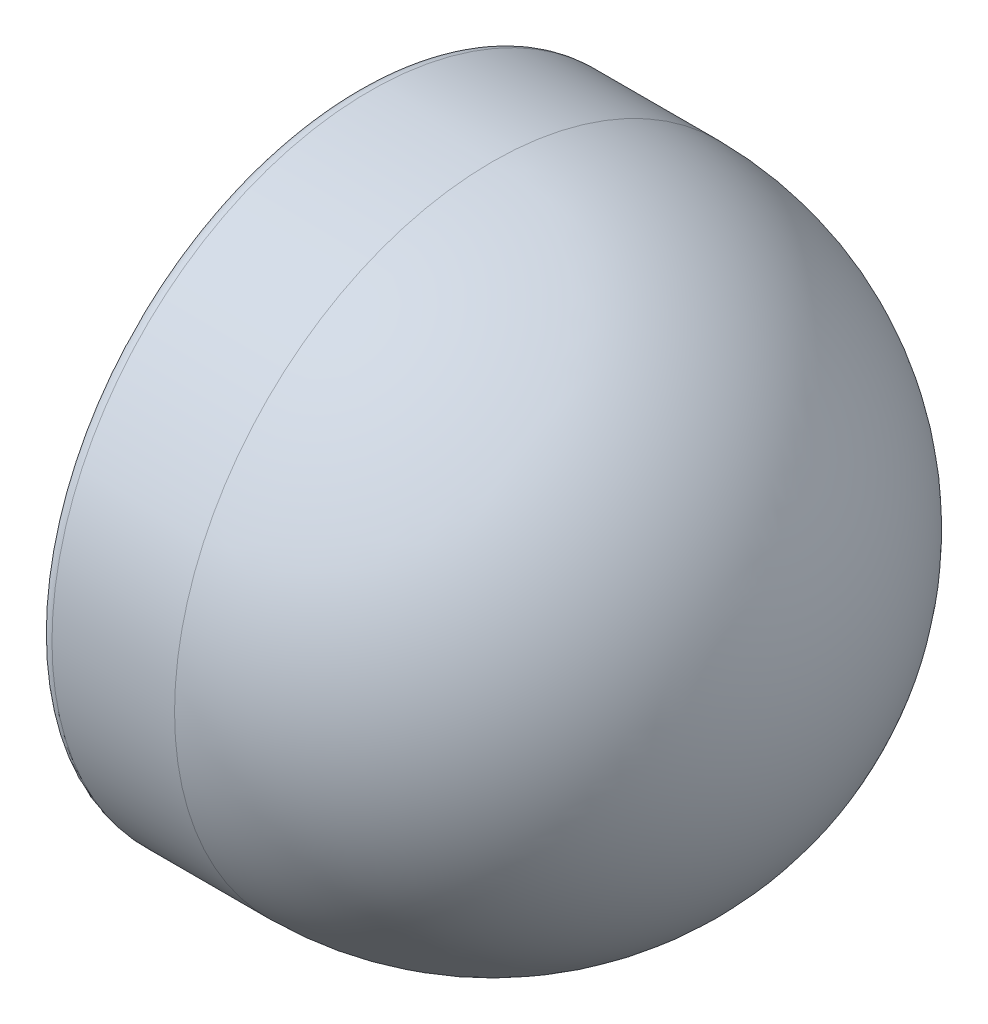
ISO-10303-21;
HEADER;
FILE_DESCRIPTION(('STEP AP214'),'2;1');
FILE_NAME('part.step','',(''),(''),'','','');
FILE_SCHEMA(('AUTOMOTIVE_DESIGN { 1 0 10303 214 1 1 1 1 }'));
ENDSEC;
DATA;
#1=APPLICATION_CONTEXT('core data for automotive mechanical design processes');
#2=APPLICATION_PROTOCOL_DEFINITION('international standard','automotive_design',2000,#1);
#3=PRODUCT_CONTEXT('',#1,'mechanical');
#4=PRODUCT('Part','Part','',(#3));
#5=PRODUCT_RELATED_PRODUCT_CATEGORY('part','',(#4));
#6=PRODUCT_DEFINITION_FORMATION('','',#4);
#7=PRODUCT_DEFINITION_CONTEXT('part definition',#1,'design');
#8=PRODUCT_DEFINITION('design','',#6,#7);
#9=PRODUCT_DEFINITION_SHAPE('','',#8);
#10=(LENGTH_UNIT() NAMED_UNIT(*) SI_UNIT(.MILLI.,.METRE.));
#11=(NAMED_UNIT(*) PLANE_ANGLE_UNIT() SI_UNIT($,.RADIAN.));
#12=(NAMED_UNIT(*) SI_UNIT($,.STERADIAN.) SOLID_ANGLE_UNIT());
#13=UNCERTAINTY_MEASURE_WITH_UNIT(LENGTH_MEASURE(1.E-05),#10,'distance_accuracy_value','');
#14=(GEOMETRIC_REPRESENTATION_CONTEXT(3) GLOBAL_UNCERTAINTY_ASSIGNED_CONTEXT((#13)) GLOBAL_UNIT_ASSIGNED_CONTEXT((#10,
#11,#12)) REPRESENTATION_CONTEXT('',''));
#15=CARTESIAN_POINT('',(0.,0.,0.));
#16=DIRECTION('',(0.,0.,1.));
#17=DIRECTION('',(1.,0.,0.));
#18=AXIS2_PLACEMENT_3D('',#15,#16,#17);
#19=CARTESIAN_POINT('',(-70.,0.,0.));
#20=DIRECTION('',(-1.,0.,0.));
#21=DIRECTION('',(0.,1.,0.));
#22=AXIS2_PLACEMENT_3D('',#19,#20,#21);
#23=SPHERICAL_SURFACE('',#22,70.);
#24=CARTESIAN_POINT('',(-70.,0.,0.));
#25=DIRECTION('',(-1.,0.,0.));
#26=DIRECTION('',(0.,0.,1.));
#27=AXIS2_PLACEMENT_3D('',#24,#25,#26);
#28=CIRCLE('',#27,70.);
#29=CARTESIAN_POINT('',(-70.,0.,70.));
#30=VERTEX_POINT('',#29);
#31=EDGE_CURVE('E10',#30,#30,#28,.T.);
#32=ORIENTED_EDGE('',*,*,#31,.F.);
#33=EDGE_LOOP('',(#32));
#34=FACE_BOUND('',#33,.T.);
#35=ADVANCED_FACE('F37',(#34),#23,.T.);
#36=CARTESIAN_POINT('',(-70.,0.,0.));
#37=DIRECTION('',(-1.,0.,0.));
#38=DIRECTION('',(0.,0.,1.));
#39=AXIS2_PLACEMENT_3D('',#36,#37,#38);
#40=CYLINDRICAL_SURFACE('',#39,70.);
#41=CARTESIAN_POINT('',(-97.,0.,0.));
#42=DIRECTION('',(-1.,0.,0.));
#43=DIRECTION('',(0.,0.,1.));
#44=AXIS2_PLACEMENT_3D('',#41,#42,#43);
#45=CIRCLE('',#44,70.);
#46=CARTESIAN_POINT('',(-97.,0.,70.));
#47=VERTEX_POINT('',#46);
#48=EDGE_CURVE('E43',#47,#47,#45,.T.);
#49=ORIENTED_EDGE('',*,*,#48,.F.);
#50=EDGE_LOOP('',(#49));
#51=FACE_BOUND('',#50,.T.);
#52=ORIENTED_EDGE('',*,*,#31,.T.);
#53=EDGE_LOOP('',(#52));
#54=FACE_BOUND('',#53,.T.);
#55=ADVANCED_FACE('F184',(#51,#54),#40,.T.);
#56=CARTESIAN_POINT('',(-97.,0.,0.));
#57=DIRECTION('',(-1.,0.,0.));
#58=DIRECTION('',(0.,0.,1.));
#59=AXIS2_PLACEMENT_3D('',#56,#57,#58);
#60=TOROIDAL_SURFACE('',#59,67.,3.);
#61=CARTESIAN_POINT('',(-100.,0.,0.));
#62=DIRECTION('',(-1.,0.,0.));
#63=DIRECTION('',(0.,0.,1.));
#64=AXIS2_PLACEMENT_3D('',#61,#62,#63);
#65=CIRCLE('',#64,67.);
#66=CARTESIAN_POINT('',(-100.,0.,67.));
#67=VERTEX_POINT('',#66);
#68=EDGE_CURVE('E47',#67,#67,#65,.T.);
#69=ORIENTED_EDGE('',*,*,#68,.F.);
#70=EDGE_LOOP('',(#69));
#71=FACE_BOUND('',#70,.T.);
#72=ORIENTED_EDGE('',*,*,#48,.T.);
#73=EDGE_LOOP('',(#72));
#74=FACE_BOUND('',#73,.T.);
#75=ADVANCED_FACE('F179',(#71,#74),#60,.T.);
#76=CARTESIAN_POINT('',(-100.,67.,0.));
#77=DIRECTION('',(1.,0.,0.));
#78=DIRECTION('',(0.,0.,-1.));
#79=AXIS2_PLACEMENT_3D('',#76,#77,#78);
#80=PLANE('',#79);
#81=CARTESIAN_POINT('',(-100.,0.,0.));
#82=DIRECTION('',(-1.,0.,0.));
#83=DIRECTION('',(0.,0.,1.));
#84=AXIS2_PLACEMENT_3D('',#81,#82,#83);
#85=CIRCLE('',#84,61.5);
#86=CARTESIAN_POINT('',(-100.,0.,61.5));
#87=VERTEX_POINT('',#86);
#88=EDGE_CURVE('E51',#87,#87,#85,.T.);
#89=ORIENTED_EDGE('',*,*,#88,.F.);
#90=EDGE_LOOP('',(#89));
#91=FACE_BOUND('',#90,.T.);
#92=ORIENTED_EDGE('',*,*,#68,.T.);
#93=EDGE_LOOP('',(#92));
#94=FACE_BOUND('',#93,.T.);
#95=ADVANCED_FACE('F173',(#91,#94),#80,.F.);
#96=CARTESIAN_POINT('',(-98.5,0.,0.));
#97=DIRECTION('',(-1.,0.,0.));
#98=DIRECTION('',(0.,0.,1.));
#99=AXIS2_PLACEMENT_3D('',#96,#97,#98);
#100=TOROIDAL_SURFACE('',#99,61.5,1.5);
#101=CARTESIAN_POINT('',(-98.5,0.,0.));
#102=DIRECTION('',(-1.,0.,0.));
#103=DIRECTION('',(0.,0.,1.));
#104=AXIS2_PLACEMENT_3D('',#101,#102,#103);
#105=CIRCLE('',#104,60.);
#106=CARTESIAN_POINT('',(-98.5,0.,60.));
#107=VERTEX_POINT('',#106);
#108=EDGE_CURVE('E56',#107,#107,#105,.T.);
#109=ORIENTED_EDGE('',*,*,#108,.F.);
#110=EDGE_LOOP('',(#109));
#111=FACE_BOUND('',#110,.T.);
#112=ORIENTED_EDGE('',*,*,#88,.T.);
#113=EDGE_LOOP('',(#112));
#114=FACE_BOUND('',#113,.T.);
#115=ADVANCED_FACE('F167',(#111,#114),#100,.T.);
#116=CARTESIAN_POINT('',(-70.,0.,0.));
#117=DIRECTION('',(-1.,0.,0.));
#118=DIRECTION('',(0.,0.,1.));
#119=AXIS2_PLACEMENT_3D('',#116,#117,#118);
#120=CYLINDRICAL_SURFACE('',#119,60.);
#121=CARTESIAN_POINT('',(-96.6213203435597,0.,0.));
#122=DIRECTION('',(-1.,0.,0.));
#123=DIRECTION('',(0.,0.,1.));
#124=AXIS2_PLACEMENT_3D('',#121,#122,#123);
#125=CIRCLE('',#124,60.);
#126=CARTESIAN_POINT('',(-96.6213203435597,0.,60.));
#127=VERTEX_POINT('',#126);
#128=EDGE_CURVE('E59',#127,#127,#125,.T.);
#129=ORIENTED_EDGE('',*,*,#128,.F.);
#130=EDGE_LOOP('',(#129));
#131=FACE_BOUND('',#130,.T.);
#132=ORIENTED_EDGE('',*,*,#108,.T.);
#133=EDGE_LOOP('',(#132));
#134=FACE_BOUND('',#133,.T.);
#135=ADVANCED_FACE('F161',(#131,#134),#120,.F.);
#136=CARTESIAN_POINT('',(-96.6213203435597,0.,0.));
#137=DIRECTION('',(-1.,0.,0.));
#138=DIRECTION('',(0.,0.,1.));
#139=AXIS2_PLACEMENT_3D('',#136,#137,#138);
#140=TOROIDAL_SURFACE('',#139,61.5,1.50000000000001);
#141=CARTESIAN_POINT('',(-95.5606601717798,0.,0.));
#142=DIRECTION('',(-1.,0.,0.));
#143=DIRECTION('',(0.,0.,1.));
#144=AXIS2_PLACEMENT_3D('',#141,#142,#143);
#145=CIRCLE('',#144,60.4393398282202);
#146=CARTESIAN_POINT('',(-95.5606601717798,0.,60.4393398282202));
#147=VERTEX_POINT('',#146);
#148=EDGE_CURVE('E62',#147,#147,#145,.T.);
#149=ORIENTED_EDGE('',*,*,#148,.F.);
#150=EDGE_LOOP('',(#149));
#151=FACE_BOUND('',#150,.T.);
#152=ORIENTED_EDGE('',*,*,#128,.T.);
#153=EDGE_LOOP('',(#152));
#154=FACE_BOUND('',#153,.T.);
#155=ADVANCED_FACE('F155',(#151,#154),#140,.T.);
#156=CARTESIAN_POINT('',(-95.5606601717798,0.,0.));
#157=DIRECTION('',(1.,0.,0.));
#158=DIRECTION('',(0.,0.,-1.));
#159=AXIS2_PLACEMENT_3D('',#156,#157,#158);
#160=CONICAL_SURFACE('',#159,60.4393398282202,0.785398163397454);
#161=CARTESIAN_POINT('',(-92.,0.,0.));
#162=DIRECTION('',(-1.,0.,0.));
#163=DIRECTION('',(0.,0.,1.));
#164=AXIS2_PLACEMENT_3D('',#161,#162,#163);
#165=CIRCLE('',#164,64.);
#166=CARTESIAN_POINT('',(-92.,0.,64.));
#167=VERTEX_POINT('',#166);
#168=EDGE_CURVE('E65',#167,#167,#165,.T.);
#169=ORIENTED_EDGE('',*,*,#168,.F.);
#170=EDGE_LOOP('',(#169));
#171=FACE_BOUND('',#170,.T.);
#172=ORIENTED_EDGE('',*,*,#148,.T.);
#173=EDGE_LOOP('',(#172));
#174=FACE_BOUND('',#173,.T.);
#175=ADVANCED_FACE('F149',(#171,#174),#160,.F.);
#176=CARTESIAN_POINT('',(-92.,64.,0.));
#177=DIRECTION('',(-1.,0.,0.));
#178=DIRECTION('',(0.,0.,1.));
#179=AXIS2_PLACEMENT_3D('',#176,#177,#178);
#180=PLANE('',#179);
#181=CARTESIAN_POINT('',(-92.,0.,0.));
#182=DIRECTION('',(-1.,0.,0.));
#183=DIRECTION('',(0.,0.,1.));
#184=AXIS2_PLACEMENT_3D('',#181,#182,#183);
#185=CIRCLE('',#184,64.7071067811866);
#186=CARTESIAN_POINT('',(-92.,0.,64.7071067811866));
#187=VERTEX_POINT('',#186);
#188=EDGE_CURVE('E68',#187,#187,#185,.T.);
#189=ORIENTED_EDGE('',*,*,#188,.F.);
#190=EDGE_LOOP('',(#189));
#191=FACE_BOUND('',#190,.T.);
#192=ORIENTED_EDGE('',*,*,#168,.T.);
#193=EDGE_LOOP('',(#192));
#194=FACE_BOUND('',#193,.T.);
#195=ADVANCED_FACE('F143',(#191,#194),#180,.F.);
#196=CARTESIAN_POINT('',(-70.,0.,0.));
#197=DIRECTION('',(-1.,0.,0.));
#198=DIRECTION('',(0.,0.,1.));
#199=AXIS2_PLACEMENT_3D('',#196,#197,#198);
#200=CYLINDRICAL_SURFACE('',#199,64.7071067811866);
#201=CARTESIAN_POINT('',(-92.7071067811866,0.,0.));
#202=DIRECTION('',(-1.,0.,0.));
#203=DIRECTION('',(0.,0.,1.));
#204=AXIS2_PLACEMENT_3D('',#201,#202,#203);
#205=CIRCLE('',#204,64.7071067811866);
#206=CARTESIAN_POINT('',(-92.7071067811866,0.,64.7071067811866));
#207=VERTEX_POINT('',#206);
#208=EDGE_CURVE('E71',#207,#207,#205,.T.);
#209=ORIENTED_EDGE('',*,*,#208,.F.);
#210=EDGE_LOOP('',(#209));
#211=FACE_BOUND('',#210,.T.);
#212=ORIENTED_EDGE('',*,*,#188,.T.);
#213=EDGE_LOOP('',(#212));
#214=FACE_BOUND('',#213,.T.);
#215=ADVANCED_FACE('F137',(#211,#214),#200,.T.);
#216=CARTESIAN_POINT('',(-92.7071067811866,0.,0.));
#217=DIRECTION('',(1.,0.,0.));
#218=DIRECTION('',(0.,0.,-1.));
#219=AXIS2_PLACEMENT_3D('',#216,#217,#218);
#220=CONICAL_SURFACE('',#219,64.7071067811866,0.785398163397451);
#221=CARTESIAN_POINT('',(-96.2677669529664,0.,0.));
#222=DIRECTION('',(-1.,0.,0.));
#223=DIRECTION('',(0.,0.,1.));
#224=AXIS2_PLACEMENT_3D('',#221,#222,#223);
#225=CIRCLE('',#224,61.1464466094067);
#226=CARTESIAN_POINT('',(-96.2677669529664,0.,61.1464466094067));
#227=VERTEX_POINT('',#226);
#228=EDGE_CURVE('E74',#227,#227,#225,.T.);
#229=ORIENTED_EDGE('',*,*,#228,.F.);
#230=EDGE_LOOP('',(#229));
#231=FACE_BOUND('',#230,.T.);
#232=ORIENTED_EDGE('',*,*,#208,.T.);
#233=EDGE_LOOP('',(#232));
#234=FACE_BOUND('',#233,.T.);
#235=ADVANCED_FACE('F131',(#231,#234),#220,.T.);
#236=CARTESIAN_POINT('',(-96.6213203435597,0.,0.));
#237=DIRECTION('',(-1.,0.,0.));
#238=DIRECTION('',(0.,0.,1.));
#239=AXIS2_PLACEMENT_3D('',#236,#237,#238);
#240=TOROIDAL_SURFACE('',#239,61.5,0.499999999999999);
#241=CARTESIAN_POINT('',(-96.6213203435597,0.,0.));
#242=DIRECTION('',(-1.,0.,0.));
#243=DIRECTION('',(0.,0.,1.));
#244=AXIS2_PLACEMENT_3D('',#241,#242,#243);
#245=CIRCLE('',#244,61.);
#246=CARTESIAN_POINT('',(-96.6213203435597,0.,61.));
#247=VERTEX_POINT('',#246);
#248=EDGE_CURVE('E77',#247,#247,#245,.T.);
#249=ORIENTED_EDGE('',*,*,#248,.F.);
#250=EDGE_LOOP('',(#249));
#251=FACE_BOUND('',#250,.T.);
#252=ORIENTED_EDGE('',*,*,#228,.T.);
#253=EDGE_LOOP('',(#252));
#254=FACE_BOUND('',#253,.T.);
#255=ADVANCED_FACE('F125',(#251,#254),#240,.F.);
#256=CARTESIAN_POINT('',(-70.,0.,0.));
#257=DIRECTION('',(-1.,0.,0.));
#258=DIRECTION('',(0.,0.,1.));
#259=AXIS2_PLACEMENT_3D('',#256,#257,#258);
#260=CYLINDRICAL_SURFACE('',#259,61.);
#261=CARTESIAN_POINT('',(-98.5,0.,0.));
#262=DIRECTION('',(-1.,0.,0.));
#263=DIRECTION('',(0.,0.,1.));
#264=AXIS2_PLACEMENT_3D('',#261,#262,#263);
#265=CIRCLE('',#264,61.);
#266=CARTESIAN_POINT('',(-98.5,0.,61.));
#267=VERTEX_POINT('',#266);
#268=EDGE_CURVE('E80',#267,#267,#265,.T.);
#269=ORIENTED_EDGE('',*,*,#268,.F.);
#270=EDGE_LOOP('',(#269));
#271=FACE_BOUND('',#270,.T.);
#272=ORIENTED_EDGE('',*,*,#248,.T.);
#273=EDGE_LOOP('',(#272));
#274=FACE_BOUND('',#273,.T.);
#275=ADVANCED_FACE('F119',(#271,#274),#260,.T.);
#276=CARTESIAN_POINT('',(-98.5,0.,0.));
#277=DIRECTION('',(-1.,0.,0.));
#278=DIRECTION('',(0.,0.,1.));
#279=AXIS2_PLACEMENT_3D('',#276,#277,#278);
#280=TOROIDAL_SURFACE('',#279,61.5,0.499999999999994);
#281=CARTESIAN_POINT('',(-99.,0.,0.));
#282=DIRECTION('',(-1.,0.,0.));
#283=DIRECTION('',(0.,0.,1.));
#284=AXIS2_PLACEMENT_3D('',#281,#282,#283);
#285=CIRCLE('',#284,61.5);
#286=CARTESIAN_POINT('',(-99.,0.,61.5));
#287=VERTEX_POINT('',#286);
#288=EDGE_CURVE('E83',#287,#287,#285,.T.);
#289=ORIENTED_EDGE('',*,*,#288,.F.);
#290=EDGE_LOOP('',(#289));
#291=FACE_BOUND('',#290,.T.);
#292=ORIENTED_EDGE('',*,*,#268,.T.);
#293=EDGE_LOOP('',(#292));
#294=FACE_BOUND('',#293,.T.);
#295=ADVANCED_FACE('F113',(#291,#294),#280,.F.);
#296=CARTESIAN_POINT('',(-99.,67.,0.));
#297=DIRECTION('',(-1.,0.,0.));
#298=DIRECTION('',(0.,0.,1.));
#299=AXIS2_PLACEMENT_3D('',#296,#297,#298);
#300=PLANE('',#299);
#301=CARTESIAN_POINT('',(-99.,0.,0.));
#302=DIRECTION('',(-1.,0.,0.));
#303=DIRECTION('',(0.,0.,1.));
#304=AXIS2_PLACEMENT_3D('',#301,#302,#303);
#305=CIRCLE('',#304,67.);
#306=CARTESIAN_POINT('',(-99.,0.,67.));
#307=VERTEX_POINT('',#306);
#308=EDGE_CURVE('E86',#307,#307,#305,.T.);
#309=ORIENTED_EDGE('',*,*,#308,.F.);
#310=EDGE_LOOP('',(#309));
#311=FACE_BOUND('',#310,.T.);
#312=ORIENTED_EDGE('',*,*,#288,.T.);
#313=EDGE_LOOP('',(#312));
#314=FACE_BOUND('',#313,.T.);
#315=ADVANCED_FACE('F107',(#311,#314),#300,.F.);
#316=CARTESIAN_POINT('',(-97.,0.,0.));
#317=DIRECTION('',(-1.,0.,0.));
#318=DIRECTION('',(0.,0.,1.));
#319=AXIS2_PLACEMENT_3D('',#316,#317,#318);
#320=TOROIDAL_SURFACE('',#319,67.,2.);
#321=CARTESIAN_POINT('',(-97.,0.,0.));
#322=DIRECTION('',(-1.,0.,0.));
#323=DIRECTION('',(0.,0.,1.));
#324=AXIS2_PLACEMENT_3D('',#321,#322,#323);
#325=CIRCLE('',#324,69.);
#326=CARTESIAN_POINT('',(-97.,0.,69.));
#327=VERTEX_POINT('',#326);
#328=EDGE_CURVE('E89',#327,#327,#325,.T.);
#329=ORIENTED_EDGE('',*,*,#328,.F.);
#330=EDGE_LOOP('',(#329));
#331=FACE_BOUND('',#330,.T.);
#332=ORIENTED_EDGE('',*,*,#308,.T.);
#333=EDGE_LOOP('',(#332));
#334=FACE_BOUND('',#333,.T.);
#335=ADVANCED_FACE('F101',(#331,#334),#320,.F.);
#336=CARTESIAN_POINT('',(-70.,0.,0.));
#337=DIRECTION('',(-1.,0.,0.));
#338=DIRECTION('',(0.,0.,1.));
#339=AXIS2_PLACEMENT_3D('',#336,#337,#338);
#340=CYLINDRICAL_SURFACE('',#339,69.);
#341=CARTESIAN_POINT('',(-70.,0.,0.));
#342=DIRECTION('',(-1.,0.,0.));
#343=DIRECTION('',(0.,0.,1.));
#344=AXIS2_PLACEMENT_3D('',#341,#342,#343);
#345=CIRCLE('',#344,69.);
#346=CARTESIAN_POINT('',(-70.,0.,69.));
#347=VERTEX_POINT('',#346);
#348=EDGE_CURVE('E92',#347,#347,#345,.T.);
#349=ORIENTED_EDGE('',*,*,#348,.F.);
#350=EDGE_LOOP('',(#349));
#351=FACE_BOUND('',#350,.T.);
#352=ORIENTED_EDGE('',*,*,#328,.T.);
#353=EDGE_LOOP('',(#352));
#354=FACE_BOUND('',#353,.T.);
#355=ADVANCED_FACE('F98',(#351,#354),#340,.F.);
#356=CARTESIAN_POINT('',(-70.,0.,0.));
#357=DIRECTION('',(-1.,0.,0.));
#358=DIRECTION('',(0.,1.,0.));
#359=AXIS2_PLACEMENT_3D('',#356,#357,#358);
#360=SPHERICAL_SURFACE('',#359,69.);
#361=ORIENTED_EDGE('',*,*,#348,.T.);
#362=EDGE_LOOP('',(#361));
#363=FACE_BOUND('',#362,.T.);
#364=ADVANCED_FACE('F96',(#363),#360,.F.);
#365=CLOSED_SHELL('',(#35,#55,#75,#95,#115,#135,#155,#175,#195,#215,#235,#255,#275,#295,#315,
#335,#355,#364));
#366=MANIFOLD_SOLID_BREP('B2',#365);
#367=ADVANCED_BREP_SHAPE_REPRESENTATION('',(#18,#366),#14);
#368=SHAPE_DEFINITION_REPRESENTATION(#9,#367);
ENDSEC;
END-ISO-10303-21;
